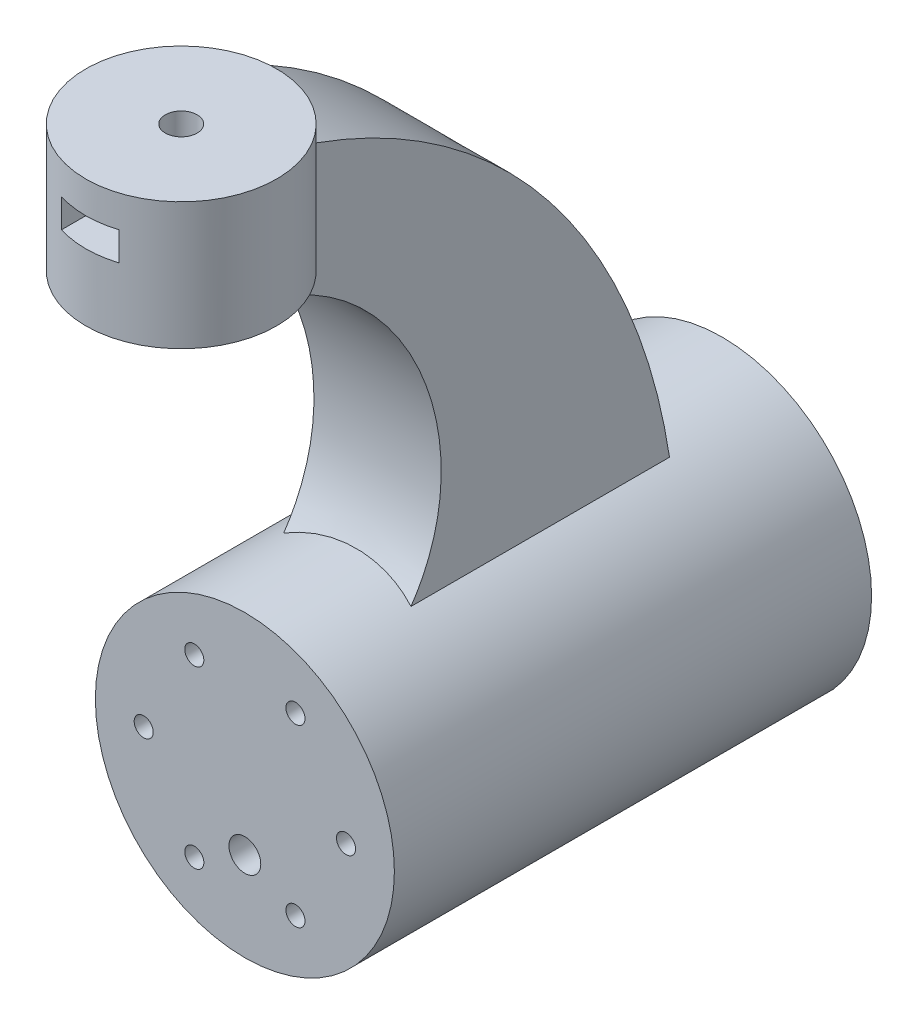
ISO-10303-21;
HEADER;
FILE_DESCRIPTION(('STEP AP214'),'2;1');
FILE_NAME('part.step','',(''),(''),'','','');
FILE_SCHEMA(('AUTOMOTIVE_DESIGN { 1 0 10303 214 1 1 1 1 }'));
ENDSEC;
DATA;
#1=APPLICATION_CONTEXT('core data for automotive mechanical design processes');
#2=APPLICATION_PROTOCOL_DEFINITION('international standard','automotive_design',2000,#1);
#3=PRODUCT_CONTEXT('',#1,'mechanical');
#4=PRODUCT('Part','Part','',(#3));
#5=PRODUCT_RELATED_PRODUCT_CATEGORY('part','',(#4));
#6=PRODUCT_DEFINITION_FORMATION('','',#4);
#7=PRODUCT_DEFINITION_CONTEXT('part definition',#1,'design');
#8=PRODUCT_DEFINITION('design','',#6,#7);
#9=PRODUCT_DEFINITION_SHAPE('','',#8);
#10=(LENGTH_UNIT() NAMED_UNIT(*) SI_UNIT(.MILLI.,.METRE.));
#11=(NAMED_UNIT(*) PLANE_ANGLE_UNIT() SI_UNIT($,.RADIAN.));
#12=(NAMED_UNIT(*) SI_UNIT($,.STERADIAN.) SOLID_ANGLE_UNIT());
#13=UNCERTAINTY_MEASURE_WITH_UNIT(LENGTH_MEASURE(1.E-05),#10,'distance_accuracy_value','');
#14=(GEOMETRIC_REPRESENTATION_CONTEXT(3) GLOBAL_UNCERTAINTY_ASSIGNED_CONTEXT((#13)) GLOBAL_UNIT_ASSIGNED_CONTEXT((#10,
#11,#12)) REPRESENTATION_CONTEXT('',''));
#15=CARTESIAN_POINT('',(0.,0.,0.));
#16=DIRECTION('',(0.,0.,1.));
#17=DIRECTION('',(1.,0.,0.));
#18=AXIS2_PLACEMENT_3D('',#15,#16,#17);
#19=CARTESIAN_POINT('',(0.,-95.,-85.));
#20=DIRECTION('',(0.,0.,1.));
#21=DIRECTION('',(1.,0.,0.));
#22=AXIS2_PLACEMENT_3D('',#19,#20,#21);
#23=CYLINDRICAL_SURFACE('',#22,19.);
#24=CARTESIAN_POINT('',(0.,-95.,-85.));
#25=DIRECTION('',(0.,0.,1.));
#26=DIRECTION('',(1.,0.,0.));
#27=AXIS2_PLACEMENT_3D('',#24,#25,#26);
#28=CIRCLE('',#27,19.);
#29=CARTESIAN_POINT('',(19.,-95.,-85.));
#30=VERTEX_POINT('',#29);
#31=EDGE_CURVE('E278',#30,#30,#28,.T.);
#32=ORIENTED_EDGE('',*,*,#31,.F.);
#33=EDGE_LOOP('',(#32));
#34=FACE_BOUND('',#33,.T.);
#35=CARTESIAN_POINT('',(0.,-95.,-15.));
#36=DIRECTION('',(0.,0.,1.));
#37=DIRECTION('',(1.,0.,0.));
#38=AXIS2_PLACEMENT_3D('',#35,#36,#37);
#39=CIRCLE('',#38,19.);
#40=CARTESIAN_POINT('',(19.,-95.,-15.));
#41=VERTEX_POINT('',#40);
#42=EDGE_CURVE('E11',#41,#41,#39,.F.);
#43=ORIENTED_EDGE('',*,*,#42,.F.);
#44=EDGE_LOOP('',(#43));
#45=FACE_BOUND('',#44,.T.);
#46=ADVANCED_FACE('F40',(#34,#45),#23,.F.);
#47=CARTESIAN_POINT('',(10.,0.,0.));
#48=DIRECTION('',(0.,0.,-1.));
#49=DIRECTION('',(0.,1.,0.));
#50=AXIS2_PLACEMENT_3D('',#47,#48,#49);
#51=PLANE('',#50);
#52=DIRECTION('',(-1.,0.,0.));
#53=VECTOR('',#52,1.);
#54=CARTESIAN_POINT('',(0.,-9.5,0.));
#55=LINE('',#54,#53);
#56=CARTESIAN_POINT('',(-2.5,-9.5,0.));
#57=VERTEX_POINT('',#56);
#58=CARTESIAN_POINT('',(-4.5,-9.5,0.));
#59=VERTEX_POINT('',#58);
#60=EDGE_CURVE('E186',#57,#59,#55,.T.);
#61=ORIENTED_EDGE('',*,*,#60,.F.);
#62=DIRECTION('',(0.,1.,0.));
#63=VECTOR('',#62,1.);
#64=CARTESIAN_POINT('',(-2.5,-30.,0.));
#65=LINE('',#64,#63);
#66=CARTESIAN_POINT('',(-2.5,-5.,0.));
#67=VERTEX_POINT('',#66);
#68=EDGE_CURVE('E152',#57,#67,#65,.T.);
#69=ORIENTED_EDGE('',*,*,#68,.T.);
#70=DIRECTION('',(-1.,0.,0.));
#71=VECTOR('',#70,1.);
#72=CARTESIAN_POINT('',(0.,-5.,0.));
#73=LINE('',#72,#71);
#74=CARTESIAN_POINT('',(-4.5,-5.,0.));
#75=VERTEX_POINT('',#74);
#76=EDGE_CURVE('E182',#67,#75,#73,.T.);
#77=ORIENTED_EDGE('',*,*,#76,.T.);
#78=DIRECTION('',(0.,-1.,0.));
#79=VECTOR('',#78,1.);
#80=CARTESIAN_POINT('',(-4.5,-9.5,0.));
#81=LINE('',#80,#79);
#82=EDGE_CURVE('E185',#75,#59,#81,.T.);
#83=ORIENTED_EDGE('',*,*,#82,.T.);
#84=EDGE_LOOP('',(#61,#69,#77,#83));
#85=FACE_BOUND('',#84,.T.);
#86=ADVANCED_FACE('F257',(#85),#51,.F.);
#87=CARTESIAN_POINT('',(0.,-20.,0.));
#88=DIRECTION('',(0.,1.,0.));
#89=DIRECTION('',(0.,0.,1.));
#90=AXIS2_PLACEMENT_3D('',#87,#88,#89);
#91=PLANE('',#90);
#92=DIRECTION('',(-1.,0.,0.));
#93=VECTOR('',#92,1.);
#94=CARTESIAN_POINT('',(10.,-20.,0.));
#95=LINE('',#94,#93);
#96=CARTESIAN_POINT('',(10.,-20.,0.));
#97=VERTEX_POINT('',#96);
#98=CARTESIAN_POINT('',(2.5,-20.,0.));
#99=VERTEX_POINT('',#98);
#100=EDGE_CURVE('E171',#97,#99,#95,.T.);
#101=ORIENTED_EDGE('',*,*,#100,.F.);
#102=DIRECTION('',(0.,0.,-1.));
#103=VECTOR('',#102,1.);
#104=CARTESIAN_POINT('',(10.,-20.,0.));
#105=LINE('',#104,#103);
#106=CARTESIAN_POINT('',(10.,-20.,-11.1803398874989));
#107=VERTEX_POINT('',#106);
#108=EDGE_CURVE('E630',#97,#107,#105,.T.);
#109=ORIENTED_EDGE('',*,*,#108,.T.);
#110=CARTESIAN_POINT('',(0.,-20.,0.));
#111=DIRECTION('',(0.,1.,0.));
#112=DIRECTION('',(0.,0.,1.));
#113=AXIS2_PLACEMENT_3D('',#110,#111,#112);
#114=CIRCLE('',#113,15.);
#115=CARTESIAN_POINT('',(-10.,-20.,-11.1803398874989));
#116=VERTEX_POINT('',#115);
#117=EDGE_CURVE('E614',#116,#107,#114,.T.);
#118=ORIENTED_EDGE('',*,*,#117,.F.);
#119=DIRECTION('',(0.,0.,-1.));
#120=VECTOR('',#119,1.);
#121=CARTESIAN_POINT('',(-10.,-20.,0.));
#122=LINE('',#121,#120);
#123=CARTESIAN_POINT('',(-10.,-20.,0.));
#124=VERTEX_POINT('',#123);
#125=EDGE_CURVE('E196',#124,#116,#122,.T.);
#126=ORIENTED_EDGE('',*,*,#125,.F.);
#127=CARTESIAN_POINT('',(-2.5,-20.,0.));
#128=VERTEX_POINT('',#127);
#129=EDGE_CURVE('E178',#128,#124,#95,.T.);
#130=ORIENTED_EDGE('',*,*,#129,.F.);
#131=CARTESIAN_POINT('',(0.,-20.,0.));
#132=DIRECTION('',(0.,1.,0.));
#133=DIRECTION('',(0.,0.,1.));
#134=AXIS2_PLACEMENT_3D('',#131,#132,#133);
#135=CIRCLE('',#134,2.5);
#136=EDGE_CURVE('E607',#128,#99,#135,.T.);
#137=ORIENTED_EDGE('',*,*,#136,.T.);
#138=EDGE_LOOP('',(#101,#109,#118,#126,#130,#137));
#139=FACE_BOUND('',#138,.T.);
#140=ADVANCED_FACE('F263',(#139),#91,.F.);
#141=CARTESIAN_POINT('',(0.,-9.5,0.));
#142=DIRECTION('',(0.,1.,0.));
#143=DIRECTION('',(0.,0.,1.));
#144=AXIS2_PLACEMENT_3D('',#141,#142,#143);
#145=PLANE('',#144);
#146=DIRECTION('',(0.,0.,-1.));
#147=VECTOR('',#146,1.);
#148=CARTESIAN_POINT('',(4.5,-9.5,2.59807621135332));
#149=LINE('',#148,#147);
#150=CARTESIAN_POINT('',(4.5,-9.5,14.3090880212542));
#151=VERTEX_POINT('',#150);
#152=CARTESIAN_POINT('',(4.5,-9.5,0.));
#153=VERTEX_POINT('',#152);
#154=EDGE_CURVE('E593',#151,#153,#149,.T.);
#155=ORIENTED_EDGE('',*,*,#154,.T.);
#156=CARTESIAN_POINT('',(2.5,-9.5,0.));
#157=VERTEX_POINT('',#156);
#158=EDGE_CURVE('E181',#153,#157,#55,.T.);
#159=ORIENTED_EDGE('',*,*,#158,.T.);
#160=CARTESIAN_POINT('',(0.,-9.5,0.));
#161=DIRECTION('',(0.,1.,0.));
#162=DIRECTION('',(0.,0.,1.));
#163=AXIS2_PLACEMENT_3D('',#160,#161,#162);
#164=CIRCLE('',#163,2.5);
#165=EDGE_CURVE('E601',#157,#57,#164,.F.);
#166=ORIENTED_EDGE('',*,*,#165,.T.);
#167=ORIENTED_EDGE('',*,*,#60,.T.);
#168=DIRECTION('',(0.,0.,1.));
#169=VECTOR('',#168,1.);
#170=CARTESIAN_POINT('',(-4.5,-9.5,-2.59807621135332));
#171=LINE('',#170,#169);
#172=CARTESIAN_POINT('',(-4.5,-9.5,14.3090880212542));
#173=VERTEX_POINT('',#172);
#174=EDGE_CURVE('E583',#59,#173,#171,.T.);
#175=ORIENTED_EDGE('',*,*,#174,.T.);
#176=CARTESIAN_POINT('',(0.,-9.5,0.));
#177=DIRECTION('',(0.,1.,0.));
#178=DIRECTION('',(0.,0.,1.));
#179=AXIS2_PLACEMENT_3D('',#176,#177,#178);
#180=CIRCLE('',#179,15.);
#181=EDGE_CURVE('E627',#151,#173,#180,.F.);
#182=ORIENTED_EDGE('',*,*,#181,.F.);
#183=EDGE_LOOP('',(#155,#159,#166,#167,#175,#182));
#184=FACE_BOUND('',#183,.T.);
#185=ADVANCED_FACE('F205',(#184),#145,.T.);
#186=CARTESIAN_POINT('',(0.,-5.,0.));
#187=DIRECTION('',(0.,1.,0.));
#188=DIRECTION('',(0.,0.,1.));
#189=AXIS2_PLACEMENT_3D('',#186,#187,#188);
#190=PLANE('',#189);
#191=CARTESIAN_POINT('',(4.5,-5.,0.));
#192=VERTEX_POINT('',#191);
#193=CARTESIAN_POINT('',(2.5,-5.,0.));
#194=VERTEX_POINT('',#193);
#195=EDGE_CURVE('E177',#192,#194,#73,.T.);
#196=ORIENTED_EDGE('',*,*,#195,.F.);
#197=DIRECTION('',(0.,0.,-1.));
#198=VECTOR('',#197,1.);
#199=CARTESIAN_POINT('',(4.5,-5.,2.59807621135332));
#200=LINE('',#199,#198);
#201=CARTESIAN_POINT('',(4.5,-5.,14.3090880212542));
#202=VERTEX_POINT('',#201);
#203=EDGE_CURVE('E594',#202,#192,#200,.T.);
#204=ORIENTED_EDGE('',*,*,#203,.F.);
#205=CARTESIAN_POINT('',(0.,-5.,0.));
#206=DIRECTION('',(0.,-1.,0.));
#207=DIRECTION('',(0.,0.,-1.));
#208=AXIS2_PLACEMENT_3D('',#205,#206,#207);
#209=CIRCLE('',#208,15.);
#210=CARTESIAN_POINT('',(-4.5,-5.,14.3090880212542));
#211=VERTEX_POINT('',#210);
#212=EDGE_CURVE('E591',#211,#202,#209,.F.);
#213=ORIENTED_EDGE('',*,*,#212,.F.);
#214=DIRECTION('',(0.,0.,1.));
#215=VECTOR('',#214,1.);
#216=CARTESIAN_POINT('',(-4.5,-5.,-2.59807621135332));
#217=LINE('',#216,#215);
#218=EDGE_CURVE('E581',#75,#211,#217,.T.);
#219=ORIENTED_EDGE('',*,*,#218,.F.);
#220=ORIENTED_EDGE('',*,*,#76,.F.);
#221=CARTESIAN_POINT('',(0.,-5.,0.));
#222=DIRECTION('',(0.,1.,0.));
#223=DIRECTION('',(0.,0.,1.));
#224=AXIS2_PLACEMENT_3D('',#221,#222,#223);
#225=CIRCLE('',#224,2.5);
#226=EDGE_CURVE('E605',#194,#67,#225,.F.);
#227=ORIENTED_EDGE('',*,*,#226,.F.);
#228=EDGE_LOOP('',(#196,#204,#213,#219,#220,#227));
#229=FACE_BOUND('',#228,.T.);
#230=ADVANCED_FACE('F515',(#229),#190,.F.);
#231=CARTESIAN_POINT('',(-4.5,-9.5,-2.59807621135332));
#232=DIRECTION('',(-1.,0.,0.));
#233=DIRECTION('',(0.,0.,1.));
#234=AXIS2_PLACEMENT_3D('',#231,#232,#233);
#235=PLANE('',#234);
#236=ORIENTED_EDGE('',*,*,#82,.F.);
#237=ORIENTED_EDGE('',*,*,#218,.T.);
#238=DIRECTION('',(0.,1.,0.));
#239=VECTOR('',#238,1.);
#240=CARTESIAN_POINT('',(-4.5,-20.,14.3090880212542));
#241=LINE('',#240,#239);
#242=EDGE_CURVE('E624',#173,#211,#241,.T.);
#243=ORIENTED_EDGE('',*,*,#242,.F.);
#244=ORIENTED_EDGE('',*,*,#174,.F.);
#245=EDGE_LOOP('',(#236,#237,#243,#244));
#246=FACE_BOUND('',#245,.T.);
#247=ADVANCED_FACE('F520',(#246),#235,.F.);
#248=CARTESIAN_POINT('',(4.5,-9.5,2.59807621135332));
#249=DIRECTION('',(1.,0.,0.));
#250=DIRECTION('',(0.,0.,-1.));
#251=AXIS2_PLACEMENT_3D('',#248,#249,#250);
#252=PLANE('',#251);
#253=DIRECTION('',(0.,1.,0.));
#254=VECTOR('',#253,1.);
#255=CARTESIAN_POINT('',(4.5,-9.5,0.));
#256=LINE('',#255,#254);
#257=EDGE_CURVE('E245',#153,#192,#256,.T.);
#258=ORIENTED_EDGE('',*,*,#257,.F.);
#259=ORIENTED_EDGE('',*,*,#154,.F.);
#260=DIRECTION('',(0.,1.,0.));
#261=VECTOR('',#260,1.);
#262=CARTESIAN_POINT('',(4.5,-20.,14.3090880212542));
#263=LINE('',#262,#261);
#264=EDGE_CURVE('E619',#202,#151,#263,.F.);
#265=ORIENTED_EDGE('',*,*,#264,.F.);
#266=ORIENTED_EDGE('',*,*,#203,.T.);
#267=EDGE_LOOP('',(#258,#259,#265,#266));
#268=FACE_BOUND('',#267,.T.);
#269=ADVANCED_FACE('F552',(#268),#252,.F.);
#270=CARTESIAN_POINT('',(0.,-20.,0.));
#271=DIRECTION('',(0.,1.,0.));
#272=DIRECTION('',(0.,0.,1.));
#273=AXIS2_PLACEMENT_3D('',#270,#271,#272);
#274=CYLINDRICAL_SURFACE('',#273,15.);
#275=DIRECTION('',(0.,1.,0.));
#276=VECTOR('',#275,1.);
#277=CARTESIAN_POINT('',(10.,-20.,-11.1803398874989));
#278=LINE('',#277,#276);
#279=CARTESIAN_POINT('',(10.,-3.17481404608277,-11.1803398874989));
#280=VERTEX_POINT('',#279);
#281=EDGE_CURVE('E64',#280,#107,#278,.F.);
#282=ORIENTED_EDGE('',*,*,#281,.F.);
#283=CARTESIAN_POINT('',(-10.,-3.17481404608277,-11.1803398874989));
#284=CARTESIAN_POINT('',(-9.79860012627537,-3.23924338649017,-11.3604844989368));
#285=CARTESIAN_POINT('',(-9.59210747727595,-3.3024801537701,-11.5353743147074));
#286=CARTESIAN_POINT('',(-9.16938355925211,-3.42616448989457,-11.8741633583894));
#287=CARTESIAN_POINT('',(-8.95314922130839,-3.48661116746445,-12.0380590817899));
#288=CARTESIAN_POINT('',(-8.5114969257201,-3.60427528012085,-12.3542785462998));
#289=CARTESIAN_POINT('',(-8.28607812252647,-3.66149241672435,-12.5066012182447));
#290=CARTESIAN_POINT('',(-7.82617948257629,-3.77238076993539,-12.7994287976597));
#291=CARTESIAN_POINT('',(-7.5916822645026,-3.82604459132219,-12.9399092150211));
#292=CARTESIAN_POINT('',(-7.1146878441912,-3.92927758745872,-13.2081820772462));
#293=CARTESIAN_POINT('',(-6.87219143302572,-3.97884716541586,-13.3359757717688));
#294=CARTESIAN_POINT('',(-6.37987047817691,-4.0734894696256,-13.5783857309811));
#295=CARTESIAN_POINT('',(-6.13004612174509,-4.11856231065433,-13.6930023320184));
#296=CARTESIAN_POINT('',(-5.49627479931357,-4.22529676905283,-13.9628792073201));
#297=CARTESIAN_POINT('',(-5.10810794246683,-4.28388988269717,-14.1095613069984));
#298=CARTESIAN_POINT('',(-4.3194601863778,-4.3888453943908,-14.3706240712393));
#299=CARTESIAN_POINT('',(-3.9189788592239,-4.4352073668866,-14.4850036119208));
#300=CARTESIAN_POINT('',(-3.10916489147425,-4.5146581316494,-14.6801330377635));
#301=CARTESIAN_POINT('',(-2.69984478551856,-4.54776456680161,-14.7609276294069));
#302=CARTESIAN_POINT('',(-1.87503495702732,-4.60004845746902,-14.8881950446769));
#303=CARTESIAN_POINT('',(-1.45954557447948,-4.61922667767969,-14.9346697525575));
#304=CARTESIAN_POINT('',(-0.644918594413032,-4.64266596531088,-14.99143254157));
#305=CARTESIAN_POINT('',(-0.245907927513343,-4.64757260287891,-15.0032867754213));
#306=CARTESIAN_POINT('',(0.551728219602001,-4.64421005433706,-14.9951544165716));
#307=CARTESIAN_POINT('',(0.950353708943395,-4.63594118844412,-14.9751685977101));
#308=CARTESIAN_POINT('',(1.74440504240981,-4.60639743172854,-14.9035575347411));
#309=CARTESIAN_POINT('',(2.13982967922674,-4.58511784573912,-14.8519208688043));
#310=CARTESIAN_POINT('',(2.92445412688925,-4.52999247203683,-14.7175402275892));
#311=CARTESIAN_POINT('',(3.31365404471253,-4.49614690052498,-14.6347967875108));
#312=CARTESIAN_POINT('',(4.07591215464092,-4.41731902105667,-14.4408694293758));
#313=CARTESIAN_POINT('',(4.44913608515175,-4.37255670759026,-14.3302460337876));
#314=CARTESIAN_POINT('',(5.18460796454807,-4.27242443844434,-14.0808605195664));
#315=CARTESIAN_POINT('',(5.54685532371088,-4.21705391399867,-13.9420968921532));
#316=CARTESIAN_POINT('',(6.2580678880408,-4.09670581999264,-13.6376744625656));
#317=CARTESIAN_POINT('',(6.60703707166086,-4.03173115701718,-13.4720237959698));
#318=CARTESIAN_POINT('',(7.2897587023197,-3.89326667679245,-13.1151736345221));
#319=CARTESIAN_POINT('',(7.62351487649744,-3.81977896100959,-12.9239804431223));
#320=CARTESIAN_POINT('',(8.3137484163763,-3.65602408844214,-12.4926636406594));
#321=CARTESIAN_POINT('',(8.6680506363551,-3.56480323722981,-12.2494170584638));
#322=CARTESIAN_POINT('',(9.35244134814911,-3.37496746574787,-11.7352002650151));
#323=CARTESIAN_POINT('',(9.68258560499282,-3.27637070986764,-11.4642975975488));
#324=CARTESIAN_POINT('',(10.,-3.17481404608277,-11.180339887499));
#325=B_SPLINE_CURVE_WITH_KNOTS('',3,(#283,#284,#285,#286,#287,#288,#289,#290,#291,#292,#293,
#294,#295,#296,#297,#298,#299,#300,#301,#302,#303,#304,#305,#306,#307,#308,#309,#310,#311,#312,
#313,#314,#315,#316,#317,#318,#319,#320,#321,#322,#323,#324),.UNSPECIFIED.,.F.,.F.,(4,2,2,2,2,2,
2,2,2,2,2,2,2,2,2,2,2,2,2,2,4),(0.,0.833271749180175,1.66680786467109,2.50042089212956,
3.33571759577708,4.17093193978983,5.00612496007209,6.26167623903293,7.51727119615828,
8.77118937856203,10.0250387123693,11.2212145771138,12.4173613704892,13.6139400712529,
14.8104981855274,15.9846901121363,17.1589450114393,18.332845260518,19.5064563446865,
20.82283749151,22.1360772786702),.UNSPECIFIED.);
#326=CARTESIAN_POINT('',(-10.,-3.1748140464768,-11.1803398874989));
#327=VERTEX_POINT('',#326);
#328=EDGE_CURVE('E189',#327,#280,#325,.T.);
#329=ORIENTED_EDGE('',*,*,#328,.F.);
#330=DIRECTION('',(0.,1.,0.));
#331=VECTOR('',#330,1.);
#332=CARTESIAN_POINT('',(-10.,-20.,-11.1803398874989));
#333=LINE('',#332,#331);
#334=EDGE_CURVE('E150',#327,#116,#333,.F.);
#335=ORIENTED_EDGE('',*,*,#334,.T.);
#336=ORIENTED_EDGE('',*,*,#117,.T.);
#337=EDGE_LOOP('',(#282,#329,#335,#336));
#338=FACE_BOUND('',#337,.T.);
#339=CARTESIAN_POINT('',(0.,0.,0.));
#340=DIRECTION('',(0.,1.,0.));
#341=DIRECTION('',(0.,0.,1.));
#342=AXIS2_PLACEMENT_3D('',#339,#340,#341);
#343=CIRCLE('',#342,15.);
#344=CARTESIAN_POINT('',(0.,0.,15.));
#345=VERTEX_POINT('',#344);
#346=EDGE_CURVE('E611',#345,#345,#343,.T.);
#347=ORIENTED_EDGE('',*,*,#346,.F.);
#348=EDGE_LOOP('',(#347));
#349=FACE_BOUND('',#348,.T.);
#350=ORIENTED_EDGE('',*,*,#242,.T.);
#351=ORIENTED_EDGE('',*,*,#212,.T.);
#352=ORIENTED_EDGE('',*,*,#264,.T.);
#353=ORIENTED_EDGE('',*,*,#181,.T.);
#354=EDGE_LOOP('',(#350,#351,#352,#353));
#355=FACE_BOUND('',#354,.T.);
#356=ADVANCED_FACE('F42',(#338,#349,#355),#274,.T.);
#357=CARTESIAN_POINT('',(0.,0.,0.));
#358=DIRECTION('',(0.,1.,0.));
#359=DIRECTION('',(0.,0.,1.));
#360=AXIS2_PLACEMENT_3D('',#357,#358,#359);
#361=PLANE('',#360);
#362=CARTESIAN_POINT('',(0.,0.,0.));
#363=DIRECTION('',(0.,1.,0.));
#364=DIRECTION('',(0.,0.,1.));
#365=AXIS2_PLACEMENT_3D('',#362,#363,#364);
#366=CIRCLE('',#365,2.5);
#367=CARTESIAN_POINT('',(0.,0.,2.5));
#368=VERTEX_POINT('',#367);
#369=EDGE_CURVE('E604',#368,#368,#366,.T.);
#370=ORIENTED_EDGE('',*,*,#369,.F.);
#371=EDGE_LOOP('',(#370));
#372=FACE_BOUND('',#371,.T.);
#373=ORIENTED_EDGE('',*,*,#346,.T.);
#374=EDGE_LOOP('',(#373));
#375=FACE_BOUND('',#374,.T.);
#376=ADVANCED_FACE('F499',(#372,#375),#361,.T.);
#377=CARTESIAN_POINT('',(0.,-20.,0.));
#378=DIRECTION('',(0.,1.,0.));
#379=DIRECTION('',(0.,0.,1.));
#380=AXIS2_PLACEMENT_3D('',#377,#378,#379);
#381=CYLINDRICAL_SURFACE('',#380,2.5);
#382=ORIENTED_EDGE('',*,*,#369,.T.);
#383=EDGE_LOOP('',(#382));
#384=FACE_BOUND('',#383,.T.);
#385=ORIENTED_EDGE('',*,*,#136,.F.);
#386=CARTESIAN_POINT('',(2.5,-20.,0.));
#387=CARTESIAN_POINT('',(2.49999924223519,-20.010640029569,-0.0713318224568461));
#388=CARTESIAN_POINT('',(2.49694530400625,-20.0215256960482,-0.142590655928667));
#389=CARTESIAN_POINT('',(2.48477906664822,-20.0437069580382,-0.284518573582058));
#390=CARTESIAN_POINT('',(2.47566730574732,-20.0550025170463,-0.355187709592569));
#391=CARTESIAN_POINT('',(2.43935482856817,-20.0893486544265,-0.565441899064675));
#392=CARTESIAN_POINT('',(2.40317658304411,-20.112892896027,-0.703502375000567));
#393=CARTESIAN_POINT('',(2.30795257821508,-20.1603490705761,-0.971389276121613));
#394=CARTESIAN_POINT('',(2.24890067692636,-20.1842611006249,-1.10121347881491));
#395=CARTESIAN_POINT('',(2.10955933659905,-20.2314092854754,-1.34905718257327));
#396=CARTESIAN_POINT('',(2.02927237882344,-20.2546455188903,-1.46707806060815));
#397=CARTESIAN_POINT('',(1.84946296507005,-20.2993420429519,-1.68814177236846));
#398=CARTESIAN_POINT('',(1.74990997458561,-20.3207994361886,-1.79116036882827));
#399=CARTESIAN_POINT('',(1.53432689122771,-20.360740910869,-1.978957428896));
#400=CARTESIAN_POINT('',(1.41829589577195,-20.3792248293223,-2.06373489270613));
#401=CARTESIAN_POINT('',(1.1747098733048,-20.4119003469212,-2.21134698174232));
#402=CARTESIAN_POINT('',(1.04733727456583,-20.4261479934171,-2.27447000133163));
#403=CARTESIAN_POINT('',(0.783359086326104,-20.4498120464848,-2.37833032085156));
#404=CARTESIAN_POINT('',(0.646755441526156,-20.4592294670695,-2.41907231937428));
#405=CARTESIAN_POINT('',(0.371639634659488,-20.4724664837814,-2.47611740375701));
#406=CARTESIAN_POINT('',(0.23324790671969,-20.4764125174906,-2.4929726952405));
#407=CARTESIAN_POINT('',(-0.04446154843755,-20.4788646584516,-2.50346200485308));
#408=CARTESIAN_POINT('',(-0.183779200267726,-20.477371203291,-2.49709789090025));
#409=CARTESIAN_POINT('',(-0.457313736670765,-20.4691033538324,-2.4616321052593));
#410=CARTESIAN_POINT('',(-0.591574698886168,-20.4624030666462,-2.43284949548345));
#411=CARTESIAN_POINT('',(-0.853349205827652,-20.4442136753847,-2.35381896058335));
#412=CARTESIAN_POINT('',(-0.980862571731216,-20.432724444466,-2.30357046689737));
#413=CARTESIAN_POINT('',(-1.16481667900987,-20.4123767862456,-2.2131300375497));
#414=CARTESIAN_POINT('',(-1.22516013828832,-20.4050366880689,-2.18029688186792));
#415=CARTESIAN_POINT('',(-1.34285801363391,-20.3894230540195,-2.10984096841924));
#416=CARTESIAN_POINT('',(-1.40021306857383,-20.3811497188648,-2.07221924034229));
#417=CARTESIAN_POINT('',(-1.51153965240599,-20.3637855298279,-1.99246968895401));
#418=CARTESIAN_POINT('',(-1.56551221060302,-20.3546949267132,-1.95034324710582));
#419=CARTESIAN_POINT('',(-1.66979218844273,-20.3358091990963,-1.86184843988003));
#420=CARTESIAN_POINT('',(-1.72009621674519,-20.3260134389293,-1.81547623665427));
#421=CARTESIAN_POINT('',(-1.8670618051104,-20.2953240069953,-1.66839267797891));
#422=CARTESIAN_POINT('',(-1.95739915462669,-20.2735038609432,-1.56141675852471));
#423=CARTESIAN_POINT('',(-2.11887818381152,-20.2285445566643,-1.3340906341034));
#424=CARTESIAN_POINT('',(-2.19001816710842,-20.2054052820916,-1.21373924854153));
#425=CARTESIAN_POINT('',(-2.28155192362457,-20.1702767245093,-1.02449125608952));
#426=CARTESIAN_POINT('',(-2.3097400525562,-20.158373955346,-0.959245118426306));
#427=CARTESIAN_POINT('',(-2.36045118302564,-20.134631324296,-0.826619892172223));
#428=CARTESIAN_POINT('',(-2.38297876826948,-20.1227914191594,-0.759242579437001));
#429=CARTESIAN_POINT('',(-2.42220527188703,-20.0993007159695,-0.622859565934707));
#430=CARTESIAN_POINT('',(-2.43890987198716,-20.0876497442127,-0.55385552303988));
#431=CARTESIAN_POINT('',(-2.46639444848519,-20.0646359713174,-0.414643070202456));
#432=CARTESIAN_POINT('',(-2.47717612949173,-20.0532730881663,-0.344435012778478));
#433=CARTESIAN_POINT('',(-2.4899652966079,-20.0349057955147,-0.228401351118591));
#434=CARTESIAN_POINT('',(-2.49372938618993,-20.0277878877131,-0.18277997643114));
#435=CARTESIAN_POINT('',(-2.4987449738133,-20.0137462649935,-0.0914457863172876));
#436=CARTESIAN_POINT('',(-2.50000054925778,-20.0068222530081,-0.0457332403712202));
#437=CARTESIAN_POINT('',(-2.5,-20.,0.));
#438=B_SPLINE_CURVE_WITH_KNOTS('',3,(#386,#387,#388,#389,#390,#391,#392,#393,#394,#395,#396,
#397,#398,#399,#400,#401,#402,#403,#404,#405,#406,#407,#408,#409,#410,#411,#412,#413,#414,#415,
#416,#417,#418,#419,#420,#421,#422,#423,#424,#425,#426,#427,#428,#429,#430,#431,#432,#433,#434,
#435,#436,#437),.UNSPECIFIED.,.F.,.F.,(4,2,2,2,2,2,2,2,2,2,2,2,2,2,2,2,2,2,2,2,2,2,2,2,2,4),(0.,
0.216227383477077,0.432435558052047,0.864167211238322,1.29601487251225,1.72781209574803,
2.1602993582856,2.59281031944572,3.0193144843565,3.44572907624546,3.86211552381195,
4.2784684753174,4.68900177460998,5.09954594827406,5.30661609195308,5.51364178418551,
5.72060416882653,5.92775551446169,6.35079559569132,6.77387304654616,6.98985307927146,
7.20565765133542,7.42125106067032,7.63678238994489,7.77569841089403,7.91438844988279),.UNSPECIFIED.);
#439=EDGE_CURVE('E137',#99,#128,#438,.T.);
#440=ORIENTED_EDGE('',*,*,#439,.F.);
#441=EDGE_LOOP('',(#385,#440));
#442=FACE_BOUND('',#441,.T.);
#443=ORIENTED_EDGE('',*,*,#226,.T.);
#444=ORIENTED_EDGE('',*,*,#68,.F.);
#445=ORIENTED_EDGE('',*,*,#165,.F.);
#446=DIRECTION('',(0.,1.,0.));
#447=VECTOR('',#446,1.);
#448=CARTESIAN_POINT('',(2.5,-30.,0.));
#449=LINE('',#448,#447);
#450=EDGE_CURVE('E155',#194,#157,#449,.F.);
#451=ORIENTED_EDGE('',*,*,#450,.F.);
#452=EDGE_LOOP('',(#443,#444,#445,#451));
#453=FACE_BOUND('',#452,.T.);
#454=ADVANCED_FACE('F490',(#384,#442,#453),#381,.F.);
#455=ORIENTED_EDGE('',*,*,#195,.T.);
#456=ORIENTED_EDGE('',*,*,#450,.T.);
#457=ORIENTED_EDGE('',*,*,#158,.F.);
#458=ORIENTED_EDGE('',*,*,#257,.T.);
#459=EDGE_LOOP('',(#455,#456,#457,#458));
#460=FACE_BOUND('',#459,.T.);
#461=ADVANCED_FACE('F203',(#460),#51,.F.);
#462=CARTESIAN_POINT('',(10.,0.,0.));
#463=CARTESIAN_POINT('',(10.,-8.89477506259285,-41.4152513778114));
#464=CARTESIAN_POINT('',(10.,-43.7741700893635,-64.2405724174806));
#465=CARTESIAN_POINT('',(10.,-80.,-67.5));
#466=B_SPLINE_CURVE_WITH_KNOTS('',3,(#462,#463,#464,#465),.UNSPECIFIED.,.F.,.F.,(4,4),(0.,1.),.UNSPECIFIED.);
#467=DIRECTION('',(-1.,0.,0.));
#468=VECTOR('',#467,1.);
#469=SURFACE_OF_LINEAR_EXTRUSION('',#466,#468);
#470=CARTESIAN_POINT('',(-10.,-73.7338296818633,-66.7384650228675));
#471=CARTESIAN_POINT('',(-9.60623646792274,-73.5486555783584,-66.7100609071896));
#472=CARTESIAN_POINT('',(-9.20724852389673,-73.3744082893317,-66.6828166217311));
#473=CARTESIAN_POINT('',(-8.40004612253742,-73.0482676163671,-66.6310523642006));
#474=CARTESIAN_POINT('',(-7.99183126651712,-72.8963752005024,-66.6065325101208));
#475=CARTESIAN_POINT('',(-7.1674268382722,-72.6154590279875,-66.5606240294023));
#476=CARTESIAN_POINT('',(-6.75123717281667,-72.4864355388715,-66.5392354393956));
#477=CARTESIAN_POINT('',(-5.9124140791518,-72.2517490199073,-66.4999448556267));
#478=CARTESIAN_POINT('',(-5.48978439910629,-72.146072917959,-66.4820409114985));
#479=CARTESIAN_POINT('',(-4.63917855689283,-71.9583487608396,-66.4499966516537));
#480=CARTESIAN_POINT('',(-4.21120260790543,-71.876299766664,-66.4358561863681));
#481=CARTESIAN_POINT('',(-3.35127865087405,-71.7361062322683,-66.4115670454019));
#482=CARTESIAN_POINT('',(-2.91933076602867,-71.67796095316,-66.4014182463353));
#483=CARTESIAN_POINT('',(-1.83541029059378,-71.5626541501917,-66.3812347280746));
#484=CARTESIAN_POINT('',(-1.18172245680363,-71.5206072231819,-66.3738092448411));
#485=CARTESIAN_POINT('',(0.126917903779924,-71.4912305723337,-66.3686281087343));
#486=CARTESIAN_POINT('',(0.781870425657821,-71.5039006362508,-66.3708724183525));
#487=CARTESIAN_POINT('',(1.87013901892314,-71.5704727662827,-66.382585214599));
#488=CARTESIAN_POINT('',(2.30447006969889,-71.6092019673924,-66.3893925743008));
#489=CARTESIAN_POINT('',(3.17021397403145,-71.710739821107,-66.4071388199576));
#490=CARTESIAN_POINT('',(3.60162704191006,-71.77354668526,-66.4180773990512));
#491=CARTESIAN_POINT('',(4.46005778978027,-71.9230059519085,-66.4439059609147));
#492=CARTESIAN_POINT('',(4.88707663811066,-72.0096518367298,-66.4587948636123));
#493=CARTESIAN_POINT('',(5.71537156632137,-72.2018286685446,-66.4914879221211));
#494=CARTESIAN_POINT('',(6.11690806107251,-72.3062690864603,-66.5091203306408));
#495=CARTESIAN_POINT('',(6.91374923081616,-72.536206949708,-66.5474921101768));
#496=CARTESIAN_POINT('',(7.30905422942776,-72.6617032975789,-66.5682313192569));
#497=CARTESIAN_POINT('',(7.96147738633581,-72.8879872809577,-66.6051134349117));
#498=CARTESIAN_POINT('',(8.22065013839109,-72.9830272079348,-66.6204778375281));
#499=CARTESIAN_POINT('',(8.73545510906207,-73.1821636236099,-66.6523504801903));
#500=CARTESIAN_POINT('',(8.99108700341441,-73.2862609354881,-66.6688588241754));
#501=CARTESIAN_POINT('',(9.49851322811932,-73.5033851745932,-66.7029121600086));
#502=CARTESIAN_POINT('',(9.75030687748841,-73.6164136648952,-66.7204573331795));
#503=CARTESIAN_POINT('',(10.,-73.7338296818633,-66.7384650228675));
#504=B_SPLINE_CURVE_WITH_KNOTS('',3,(#470,#471,#472,#473,#474,#475,#476,#477,#478,#479,#480,
#481,#482,#483,#484,#485,#486,#487,#488,#489,#490,#491,#492,#493,#494,#495,#496,#497,#498,#499,
#500,#501,#502,#503),.UNSPECIFIED.,.F.,.F.,(4,2,2,2,2,2,2,2,2,2,2,2,2,2,2,2,4),(0.,
1.30800606976993,2.61606876581814,3.92414676334327,5.23149050715352,6.53878228645303,
7.84603365299494,9.80881812397192,11.7715949814113,13.0792801419892,14.3868681885427,
15.6940990904593,16.9393332602156,18.1845025469888,19.0137737535288,19.8431204072451,
20.6726125305183),.UNSPECIFIED.);
#505=CARTESIAN_POINT('',(-10.,-73.7338296818633,-66.7384650228674));
#506=VERTEX_POINT('',#505);
#507=CARTESIAN_POINT('',(10.,-73.7338296818633,-66.7384650228675));
#508=VERTEX_POINT('',#507);
#509=EDGE_CURVE('E131',#506,#508,#504,.T.);
#510=ORIENTED_EDGE('',*,*,#509,.F.);
#511=CARTESIAN_POINT('',(-10.,0.,0.));
#512=CARTESIAN_POINT('',(-10.,-8.89477506259285,-41.4152513778114));
#513=CARTESIAN_POINT('',(-10.,-43.7741700893635,-64.2405724174806));
#514=CARTESIAN_POINT('',(-10.,-80.,-67.5));
#515=B_SPLINE_CURVE_WITH_KNOTS('',3,(#511,#512,#513,#514),.UNSPECIFIED.,.F.,.F.,(4,4),(0.,1.),.UNSPECIFIED.);
#516=EDGE_CURVE('E142',#327,#506,#515,.T.);
#517=ORIENTED_EDGE('',*,*,#516,.F.);
#518=ORIENTED_EDGE('',*,*,#328,.T.);
#519=EDGE_CURVE('E144',#280,#508,#466,.T.);
#520=ORIENTED_EDGE('',*,*,#519,.T.);
#521=EDGE_LOOP('',(#510,#517,#518,#520));
#522=FACE_BOUND('',#521,.T.);
#523=ADVANCED_FACE('F141',(#522),#469,.T.);
#524=CARTESIAN_POINT('',(10.,-20.,0.));
#525=CARTESIAN_POINT('',(10.,-24.0703342402127,-27.2842631028096));
#526=CARTESIAN_POINT('',(10.,-63.4000097751706,-42.4562000248171));
#527=CARTESIAN_POINT('',(10.,-80.,-20.));
#528=B_SPLINE_CURVE_WITH_KNOTS('',3,(#524,#525,#526,#527),.UNSPECIFIED.,.F.,.F.,(4,4),(0.,1.),.UNSPECIFIED.);
#529=DIRECTION('',(-1.,0.,0.));
#530=VECTOR('',#529,1.);
#531=SURFACE_OF_LINEAR_EXTRUSION('',#528,#530);
#532=CARTESIAN_POINT('',(-10.,-20.,0.));
#533=CARTESIAN_POINT('',(-10.,-24.0703342402127,-27.2842631028096));
#534=CARTESIAN_POINT('',(-10.,-63.4000097751706,-42.4562000248171));
#535=CARTESIAN_POINT('',(-10.,-80.,-20.));
#536=B_SPLINE_CURVE_WITH_KNOTS('',3,(#532,#533,#534,#535),.UNSPECIFIED.,.F.,.F.,(4,4),(0.,1.),.UNSPECIFIED.);
#537=CARTESIAN_POINT('',(-10.,-73.733829681865,-26.1064632107406));
#538=VERTEX_POINT('',#537);
#539=EDGE_CURVE('E151',#124,#538,#536,.T.);
#540=ORIENTED_EDGE('',*,*,#539,.T.);
#541=CARTESIAN_POINT('',(-10.,-73.7338296818633,-26.1064632107418));
#542=CARTESIAN_POINT('',(-9.67083521077281,-73.5790134081496,-26.2133183106855));
#543=CARTESIAN_POINT('',(-9.33616381199183,-73.4310055041875,-26.3129950045543));
#544=CARTESIAN_POINT('',(-8.65717950850527,-73.1496486176265,-26.4986689845208));
#545=CARTESIAN_POINT('',(-8.31287069884833,-73.0162935240479,-26.5846719799984));
#546=CARTESIAN_POINT('',(-7.61574530323099,-72.765167465312,-26.7437551793489));
#547=CARTESIAN_POINT('',(-7.26292969030461,-72.6473947277013,-26.816836853308));
#548=CARTESIAN_POINT('',(-6.55058712157579,-72.4283717922702,-26.9506520869791));
#549=CARTESIAN_POINT('',(-6.19107257361212,-72.3270938894641,-27.0114063950313));
#550=CARTESIAN_POINT('',(-5.46593486064983,-72.1414425091973,-27.1213367241121));
#551=CARTESIAN_POINT('',(-5.10031123956904,-72.0570703000212,-27.1705118765074));
#552=CARTESIAN_POINT('',(-4.36416777390653,-71.9057312947367,-27.2578068530595));
#553=CARTESIAN_POINT('',(-3.99364780137329,-71.8387649544275,-27.2959263877109));
#554=CARTESIAN_POINT('',(-3.24922377440934,-71.7226647463256,-27.3615099115713));
#555=CARTESIAN_POINT('',(-2.87532293282601,-71.6735154666538,-27.3889831113589));
#556=CARTESIAN_POINT('',(-2.12499190675553,-71.5932324369525,-27.4336410038789));
#557=CARTESIAN_POINT('',(-1.74856178267776,-71.5620982581867,-27.4508259414592));
#558=CARTESIAN_POINT('',(-0.994320385795488,-71.5180062026088,-27.4751136293877));
#559=CARTESIAN_POINT('',(-0.616509131332639,-71.5050480852883,-27.4822165131431));
#560=CARTESIAN_POINT('',(0.139418015598388,-71.4973734231477,-27.4864268494797));
#561=CARTESIAN_POINT('',(0.517533948466142,-71.5026599313557,-27.4835326291605));
#562=CARTESIAN_POINT('',(1.2728646344805,-71.5314538009037,-27.467709946412));
#563=CARTESIAN_POINT('',(1.65007937460602,-71.5549614239371,-27.4547813398679));
#564=CARTESIAN_POINT('',(2.40249155641747,-71.6200808201011,-27.4187322385157));
#565=CARTESIAN_POINT('',(2.77768884971984,-71.6616939069403,-27.3956110041424));
#566=CARTESIAN_POINT('',(3.45116004609638,-71.7528259653312,-27.344497149278));
#567=CARTESIAN_POINT('',(3.75001080389695,-71.7991670286365,-27.3183646603974));
#568=CARTESIAN_POINT('',(4.34505735156792,-71.903210229395,-27.2591586491765));
#569=CARTESIAN_POINT('',(4.64125301003048,-71.9609129259546,-27.2260847852455));
#570=CARTESIAN_POINT('',(5.23035009619196,-72.0874662961753,-27.1527614885542));
#571=CARTESIAN_POINT('',(5.52325158813107,-72.156316752037,-27.1125121959822));
#572=CARTESIAN_POINT('',(6.1051359509975,-72.3049019375218,-27.0245631639765));
#573=CARTESIAN_POINT('',(6.39411901004634,-72.3846361425743,-26.9768637836032));
#574=CARTESIAN_POINT('',(6.96816484108992,-72.5548559745143,-26.8735929959312));
#575=CARTESIAN_POINT('',(7.25321798942103,-72.645364064082,-26.8180050936754));
#576=CARTESIAN_POINT('',(7.81815172962849,-72.8366191922167,-26.6986910318238));
#577=CARTESIAN_POINT('',(8.09803215474761,-72.9373665601975,-26.6349646103821));
#578=CARTESIAN_POINT('',(8.65202558551272,-73.1486770513799,-26.4990012364919));
#579=CARTESIAN_POINT('',(8.92613751591163,-73.2592419848755,-26.4267627136619));
#580=CARTESIAN_POINT('',(9.46801719534331,-73.4896878248628,-26.2733816246536));
#581=CARTESIAN_POINT('',(9.7357823086342,-73.6095725162349,-26.1922354353801));
#582=CARTESIAN_POINT('',(10.,-73.7338296818632,-26.1064632107419));
#583=B_SPLINE_CURVE_WITH_KNOTS('',3,(#541,#542,#543,#544,#545,#546,#547,#548,#549,#550,#551,
#552,#553,#554,#555,#556,#557,#558,#559,#560,#561,#562,#563,#564,#565,#566,#567,#568,#569,#570,
#571,#572,#573,#574,#575,#576,#577,#578,#579,#580,#581,#582),.UNSPECIFIED.,.F.,.F.,(4,2,2,2,2,2,
2,2,2,2,2,2,2,2,2,2,2,2,2,2,4),(0.,1.13717386564243,2.27387165630406,3.41044003910825,
4.54507928478253,5.67980362055811,6.81455766783431,7.94832778962371,9.08207092802959,
10.2157990644336,11.3497169263949,12.4836510741028,13.617667512303,14.5280267779146,
15.4384308535475,16.3488171443155,17.2591595721379,18.1714343757749,19.0837385380292,
19.9962112738555,20.9090565328081),.UNSPECIFIED.);
#584=CARTESIAN_POINT('',(10.,-73.7338296818633,-26.1064632107418));
#585=VERTEX_POINT('',#584);
#586=EDGE_CURVE('E56',#538,#585,#583,.T.);
#587=ORIENTED_EDGE('',*,*,#586,.T.);
#588=EDGE_CURVE('E160',#97,#585,#528,.T.);
#589=ORIENTED_EDGE('',*,*,#588,.F.);
#590=ORIENTED_EDGE('',*,*,#100,.T.);
#591=ORIENTED_EDGE('',*,*,#439,.T.);
#592=ORIENTED_EDGE('',*,*,#129,.T.);
#593=EDGE_LOOP('',(#540,#587,#589,#590,#591,#592));
#594=FACE_BOUND('',#593,.T.);
#595=ADVANCED_FACE('F202',(#594),#531,.F.);
#596=CARTESIAN_POINT('',(10.,0.,0.));
#597=DIRECTION('',(1.,0.,0.));
#598=DIRECTION('',(0.,0.,-1.));
#599=AXIS2_PLACEMENT_3D('',#596,#597,#598);
#600=PLANE('',#599);
#601=DIRECTION('',(0.,0.,1.));
#602=VECTOR('',#601,1.);
#603=CARTESIAN_POINT('',(10.,-73.7338296818633,-85.));
#604=LINE('',#603,#602);
#605=EDGE_CURVE('E145',#508,#585,#604,.T.);
#606=ORIENTED_EDGE('',*,*,#605,.F.);
#607=ORIENTED_EDGE('',*,*,#519,.F.);
#608=ORIENTED_EDGE('',*,*,#281,.T.);
#609=ORIENTED_EDGE('',*,*,#108,.F.);
#610=ORIENTED_EDGE('',*,*,#588,.T.);
#611=EDGE_LOOP('',(#606,#607,#608,#609,#610));
#612=FACE_BOUND('',#611,.T.);
#613=ADVANCED_FACE('F237',(#612),#600,.T.);
#614=CARTESIAN_POINT('',(-10.,0.,0.));
#615=DIRECTION('',(1.,0.,0.));
#616=DIRECTION('',(0.,0.,-1.));
#617=AXIS2_PLACEMENT_3D('',#614,#615,#616);
#618=PLANE('',#617);
#619=ORIENTED_EDGE('',*,*,#516,.T.);
#620=DIRECTION('',(0.,0.,1.));
#621=VECTOR('',#620,1.);
#622=CARTESIAN_POINT('',(-10.,-73.7338296818633,-85.));
#623=LINE('',#622,#621);
#624=EDGE_CURVE('E49',#506,#538,#623,.T.);
#625=ORIENTED_EDGE('',*,*,#624,.T.);
#626=ORIENTED_EDGE('',*,*,#539,.F.);
#627=ORIENTED_EDGE('',*,*,#125,.T.);
#628=ORIENTED_EDGE('',*,*,#334,.F.);
#629=EDGE_LOOP('',(#619,#625,#626,#627,#628));
#630=FACE_BOUND('',#629,.T.);
#631=ADVANCED_FACE('F148',(#630),#618,.F.);
#632=CARTESIAN_POINT('',(0.,-95.,-85.));
#633=DIRECTION('',(0.,0.,1.));
#634=DIRECTION('',(1.,0.,0.));
#635=AXIS2_PLACEMENT_3D('',#632,#633,#634);
#636=CYLINDRICAL_SURFACE('',#635,23.5);
#637=ORIENTED_EDGE('',*,*,#509,.T.);
#638=ORIENTED_EDGE('',*,*,#605,.T.);
#639=ORIENTED_EDGE('',*,*,#586,.F.);
#640=ORIENTED_EDGE('',*,*,#624,.F.);
#641=EDGE_LOOP('',(#637,#638,#639,#640));
#642=FACE_BOUND('',#641,.T.);
#643=CARTESIAN_POINT('',(0.,-95.,-85.));
#644=DIRECTION('',(0.,0.,1.));
#645=DIRECTION('',(1.,0.,0.));
#646=AXIS2_PLACEMENT_3D('',#643,#644,#645);
#647=CIRCLE('',#646,23.5);
#648=CARTESIAN_POINT('',(23.5,-95.,-85.));
#649=VERTEX_POINT('',#648);
#650=EDGE_CURVE('E281',#649,#649,#647,.T.);
#651=ORIENTED_EDGE('',*,*,#650,.T.);
#652=EDGE_LOOP('',(#651));
#653=FACE_BOUND('',#652,.T.);
#654=CARTESIAN_POINT('',(0.,-95.,-10.));
#655=DIRECTION('',(0.,0.,1.));
#656=DIRECTION('',(1.,0.,0.));
#657=AXIS2_PLACEMENT_3D('',#654,#655,#656);
#658=CIRCLE('',#657,23.5);
#659=CARTESIAN_POINT('',(23.5,-95.,-10.));
#660=VERTEX_POINT('',#659);
#661=EDGE_CURVE('E282',#660,#660,#658,.T.);
#662=ORIENTED_EDGE('',*,*,#661,.F.);
#663=EDGE_LOOP('',(#662));
#664=FACE_BOUND('',#663,.T.);
#665=ADVANCED_FACE('F129',(#642,#653,#664),#636,.T.);
#666=CARTESIAN_POINT('',(0.,-95.,-85.));
#667=DIRECTION('',(0.,0.,1.));
#668=DIRECTION('',(1.,0.,0.));
#669=AXIS2_PLACEMENT_3D('',#666,#667,#668);
#670=PLANE('',#669);
#671=ORIENTED_EDGE('',*,*,#31,.T.);
#672=EDGE_LOOP('',(#671));
#673=FACE_BOUND('',#672,.T.);
#674=ORIENTED_EDGE('',*,*,#650,.F.);
#675=EDGE_LOOP('',(#674));
#676=FACE_BOUND('',#675,.T.);
#677=ADVANCED_FACE('F231',(#673,#676),#670,.F.);
#678=CARTESIAN_POINT('',(0.,-95.,-10.));
#679=DIRECTION('',(0.,0.,1.));
#680=DIRECTION('',(1.,0.,0.));
#681=AXIS2_PLACEMENT_3D('',#678,#679,#680);
#682=PLANE('',#681);
#683=CARTESIAN_POINT('',(15.9,-95.,-10.));
#684=DIRECTION('',(0.,0.,1.));
#685=DIRECTION('',(1.,0.,0.));
#686=AXIS2_PLACEMENT_3D('',#683,#684,#685);
#687=CIRCLE('',#686,1.5);
#688=CARTESIAN_POINT('',(17.4,-95.,-10.));
#689=VERTEX_POINT('',#688);
#690=EDGE_CURVE('E324',#689,#689,#687,.T.);
#691=ORIENTED_EDGE('',*,*,#690,.F.);
#692=EDGE_LOOP('',(#691));
#693=FACE_BOUND('',#692,.T.);
#694=CARTESIAN_POINT('',(0.,-104.5,-10.));
#695=DIRECTION('',(0.,0.,1.));
#696=DIRECTION('',(1.,0.,0.));
#697=AXIS2_PLACEMENT_3D('',#694,#695,#696);
#698=CIRCLE('',#697,2.5);
#699=CARTESIAN_POINT('',(2.5,-104.5,-10.));
#700=VERTEX_POINT('',#699);
#701=EDGE_CURVE('E318',#700,#700,#698,.T.);
#702=ORIENTED_EDGE('',*,*,#701,.F.);
#703=EDGE_LOOP('',(#702));
#704=FACE_BOUND('',#703,.T.);
#705=CARTESIAN_POINT('',(7.94999999999999,-108.769803920173,-10.));
#706=DIRECTION('',(0.,0.,1.));
#707=DIRECTION('',(1.,0.,0.));
#708=AXIS2_PLACEMENT_3D('',#705,#706,#707);
#709=CIRCLE('',#708,1.5);
#710=CARTESIAN_POINT('',(9.44999999999998,-108.769803920173,-10.));
#711=VERTEX_POINT('',#710);
#712=EDGE_CURVE('E312',#711,#711,#709,.T.);
#713=ORIENTED_EDGE('',*,*,#712,.F.);
#714=EDGE_LOOP('',(#713));
#715=FACE_BOUND('',#714,.T.);
#716=CARTESIAN_POINT('',(-7.9500000000001,-108.769803920173,-10.));
#717=DIRECTION('',(0.,0.,1.));
#718=DIRECTION('',(1.,0.,0.));
#719=AXIS2_PLACEMENT_3D('',#716,#717,#718);
#720=CIRCLE('',#719,1.5);
#721=CARTESIAN_POINT('',(-6.4500000000001,-108.769803920173,-10.));
#722=VERTEX_POINT('',#721);
#723=EDGE_CURVE('E306',#722,#722,#720,.T.);
#724=ORIENTED_EDGE('',*,*,#723,.F.);
#725=EDGE_LOOP('',(#724));
#726=FACE_BOUND('',#725,.T.);
#727=CARTESIAN_POINT('',(-15.9,-94.9999999999999,-10.));
#728=DIRECTION('',(0.,0.,1.));
#729=DIRECTION('',(1.,0.,0.));
#730=AXIS2_PLACEMENT_3D('',#727,#728,#729);
#731=CIRCLE('',#730,1.5);
#732=CARTESIAN_POINT('',(-14.4,-94.9999999999999,-10.));
#733=VERTEX_POINT('',#732);
#734=EDGE_CURVE('E300',#733,#733,#731,.T.);
#735=ORIENTED_EDGE('',*,*,#734,.F.);
#736=EDGE_LOOP('',(#735));
#737=FACE_BOUND('',#736,.T.);
#738=CARTESIAN_POINT('',(-7.94999999999987,-81.2301960798273,-10.));
#739=DIRECTION('',(0.,0.,1.));
#740=DIRECTION('',(1.,0.,0.));
#741=AXIS2_PLACEMENT_3D('',#738,#739,#740);
#742=CIRCLE('',#741,1.49999999999999);
#743=CARTESIAN_POINT('',(-6.44999999999989,-81.2301960798273,-10.));
#744=VERTEX_POINT('',#743);
#745=EDGE_CURVE('E294',#744,#744,#742,.T.);
#746=ORIENTED_EDGE('',*,*,#745,.F.);
#747=EDGE_LOOP('',(#746));
#748=FACE_BOUND('',#747,.T.);
#749=CARTESIAN_POINT('',(7.95000000000018,-81.2301960798275,-10.));
#750=DIRECTION('',(0.,0.,1.));
#751=DIRECTION('',(1.,0.,0.));
#752=AXIS2_PLACEMENT_3D('',#749,#750,#751);
#753=CIRCLE('',#752,1.49999999999999);
#754=CARTESIAN_POINT('',(9.45000000000017,-81.2301960798275,-10.));
#755=VERTEX_POINT('',#754);
#756=EDGE_CURVE('E288',#755,#755,#753,.T.);
#757=ORIENTED_EDGE('',*,*,#756,.F.);
#758=EDGE_LOOP('',(#757));
#759=FACE_BOUND('',#758,.T.);
#760=ORIENTED_EDGE('',*,*,#661,.T.);
#761=EDGE_LOOP('',(#760));
#762=FACE_BOUND('',#761,.T.);
#763=ADVANCED_FACE('F232',(#693,#704,#715,#726,#737,#748,#759,#762),#682,.T.);
#764=CARTESIAN_POINT('',(0.,-95.,-15.));
#765=DIRECTION('',(0.,0.,1.));
#766=DIRECTION('',(1.,0.,0.));
#767=AXIS2_PLACEMENT_3D('',#764,#765,#766);
#768=PLANE('',#767);
#769=CARTESIAN_POINT('',(15.9,-95.,-15.));
#770=DIRECTION('',(0.,0.,1.));
#771=DIRECTION('',(1.,0.,0.));
#772=AXIS2_PLACEMENT_3D('',#769,#770,#771);
#773=CIRCLE('',#772,1.5);
#774=CARTESIAN_POINT('',(17.4,-95.,-15.));
#775=VERTEX_POINT('',#774);
#776=EDGE_CURVE('E287',#775,#775,#773,.T.);
#777=ORIENTED_EDGE('',*,*,#776,.T.);
#778=EDGE_LOOP('',(#777));
#779=FACE_BOUND('',#778,.T.);
#780=CARTESIAN_POINT('',(0.,-104.5,-15.));
#781=DIRECTION('',(0.,0.,1.));
#782=DIRECTION('',(1.,0.,0.));
#783=AXIS2_PLACEMENT_3D('',#780,#781,#782);
#784=CIRCLE('',#783,2.5);
#785=CARTESIAN_POINT('',(2.5,-104.5,-15.));
#786=VERTEX_POINT('',#785);
#787=EDGE_CURVE('E321',#786,#786,#784,.T.);
#788=ORIENTED_EDGE('',*,*,#787,.T.);
#789=EDGE_LOOP('',(#788));
#790=FACE_BOUND('',#789,.T.);
#791=CARTESIAN_POINT('',(7.94999999999999,-108.769803920173,-15.));
#792=DIRECTION('',(0.,0.,1.));
#793=DIRECTION('',(1.,0.,0.));
#794=AXIS2_PLACEMENT_3D('',#791,#792,#793);
#795=CIRCLE('',#794,1.5);
#796=CARTESIAN_POINT('',(9.44999999999998,-108.769803920173,-15.));
#797=VERTEX_POINT('',#796);
#798=EDGE_CURVE('E315',#797,#797,#795,.T.);
#799=ORIENTED_EDGE('',*,*,#798,.T.);
#800=EDGE_LOOP('',(#799));
#801=FACE_BOUND('',#800,.T.);
#802=CARTESIAN_POINT('',(-7.9500000000001,-108.769803920173,-15.));
#803=DIRECTION('',(0.,0.,1.));
#804=DIRECTION('',(1.,0.,0.));
#805=AXIS2_PLACEMENT_3D('',#802,#803,#804);
#806=CIRCLE('',#805,1.5);
#807=CARTESIAN_POINT('',(-6.4500000000001,-108.769803920173,-15.));
#808=VERTEX_POINT('',#807);
#809=EDGE_CURVE('E309',#808,#808,#806,.T.);
#810=ORIENTED_EDGE('',*,*,#809,.T.);
#811=EDGE_LOOP('',(#810));
#812=FACE_BOUND('',#811,.T.);
#813=CARTESIAN_POINT('',(-15.9,-94.9999999999999,-15.));
#814=DIRECTION('',(0.,0.,1.));
#815=DIRECTION('',(1.,0.,0.));
#816=AXIS2_PLACEMENT_3D('',#813,#814,#815);
#817=CIRCLE('',#816,1.5);
#818=CARTESIAN_POINT('',(-14.4,-94.9999999999999,-15.));
#819=VERTEX_POINT('',#818);
#820=EDGE_CURVE('E303',#819,#819,#817,.T.);
#821=ORIENTED_EDGE('',*,*,#820,.T.);
#822=EDGE_LOOP('',(#821));
#823=FACE_BOUND('',#822,.T.);
#824=CARTESIAN_POINT('',(-7.94999999999987,-81.2301960798273,-15.));
#825=DIRECTION('',(0.,0.,1.));
#826=DIRECTION('',(1.,0.,0.));
#827=AXIS2_PLACEMENT_3D('',#824,#825,#826);
#828=CIRCLE('',#827,1.49999999999999);
#829=CARTESIAN_POINT('',(-6.44999999999989,-81.2301960798273,-15.));
#830=VERTEX_POINT('',#829);
#831=EDGE_CURVE('E297',#830,#830,#828,.T.);
#832=ORIENTED_EDGE('',*,*,#831,.T.);
#833=EDGE_LOOP('',(#832));
#834=FACE_BOUND('',#833,.T.);
#835=CARTESIAN_POINT('',(7.95000000000018,-81.2301960798275,-15.));
#836=DIRECTION('',(0.,0.,1.));
#837=DIRECTION('',(1.,0.,0.));
#838=AXIS2_PLACEMENT_3D('',#835,#836,#837);
#839=CIRCLE('',#838,1.49999999999999);
#840=CARTESIAN_POINT('',(9.45000000000017,-81.2301960798275,-15.));
#841=VERTEX_POINT('',#840);
#842=EDGE_CURVE('E291',#841,#841,#839,.T.);
#843=ORIENTED_EDGE('',*,*,#842,.T.);
#844=EDGE_LOOP('',(#843));
#845=FACE_BOUND('',#844,.T.);
#846=ORIENTED_EDGE('',*,*,#42,.T.);
#847=EDGE_LOOP('',(#846));
#848=FACE_BOUND('',#847,.T.);
#849=ADVANCED_FACE('F268',(#779,#790,#801,#812,#823,#834,#845,#848),#768,.F.);
#850=CARTESIAN_POINT('',(7.95000000000018,-81.2301960798275,-15.));
#851=DIRECTION('',(0.,0.,1.));
#852=DIRECTION('',(1.,0.,0.));
#853=AXIS2_PLACEMENT_3D('',#850,#851,#852);
#854=CYLINDRICAL_SURFACE('',#853,1.49999999999999);
#855=ORIENTED_EDGE('',*,*,#842,.F.);
#856=EDGE_LOOP('',(#855));
#857=FACE_BOUND('',#856,.T.);
#858=ORIENTED_EDGE('',*,*,#756,.T.);
#859=EDGE_LOOP('',(#858));
#860=FACE_BOUND('',#859,.T.);
#861=ADVANCED_FACE('F354',(#857,#860),#854,.F.);
#862=CARTESIAN_POINT('',(-7.94999999999987,-81.2301960798273,-15.));
#863=DIRECTION('',(0.,0.,1.));
#864=DIRECTION('',(1.,0.,0.));
#865=AXIS2_PLACEMENT_3D('',#862,#863,#864);
#866=CYLINDRICAL_SURFACE('',#865,1.49999999999999);
#867=ORIENTED_EDGE('',*,*,#831,.F.);
#868=EDGE_LOOP('',(#867));
#869=FACE_BOUND('',#868,.T.);
#870=ORIENTED_EDGE('',*,*,#745,.T.);
#871=EDGE_LOOP('',(#870));
#872=FACE_BOUND('',#871,.T.);
#873=ADVANCED_FACE('F356',(#869,#872),#866,.F.);
#874=CARTESIAN_POINT('',(-15.9,-94.9999999999999,-15.));
#875=DIRECTION('',(0.,0.,1.));
#876=DIRECTION('',(1.,0.,0.));
#877=AXIS2_PLACEMENT_3D('',#874,#875,#876);
#878=CYLINDRICAL_SURFACE('',#877,1.5);
#879=ORIENTED_EDGE('',*,*,#820,.F.);
#880=EDGE_LOOP('',(#879));
#881=FACE_BOUND('',#880,.T.);
#882=ORIENTED_EDGE('',*,*,#734,.T.);
#883=EDGE_LOOP('',(#882));
#884=FACE_BOUND('',#883,.T.);
#885=ADVANCED_FACE('F362',(#881,#884),#878,.F.);
#886=CARTESIAN_POINT('',(-7.9500000000001,-108.769803920173,-15.));
#887=DIRECTION('',(0.,0.,1.));
#888=DIRECTION('',(1.,0.,0.));
#889=AXIS2_PLACEMENT_3D('',#886,#887,#888);
#890=CYLINDRICAL_SURFACE('',#889,1.5);
#891=ORIENTED_EDGE('',*,*,#809,.F.);
#892=EDGE_LOOP('',(#891));
#893=FACE_BOUND('',#892,.T.);
#894=ORIENTED_EDGE('',*,*,#723,.T.);
#895=EDGE_LOOP('',(#894));
#896=FACE_BOUND('',#895,.T.);
#897=ADVANCED_FACE('F369',(#893,#896),#890,.F.);
#898=CARTESIAN_POINT('',(7.94999999999999,-108.769803920173,-15.));
#899=DIRECTION('',(0.,0.,1.));
#900=DIRECTION('',(1.,0.,0.));
#901=AXIS2_PLACEMENT_3D('',#898,#899,#900);
#902=CYLINDRICAL_SURFACE('',#901,1.5);
#903=ORIENTED_EDGE('',*,*,#798,.F.);
#904=EDGE_LOOP('',(#903));
#905=FACE_BOUND('',#904,.T.);
#906=ORIENTED_EDGE('',*,*,#712,.T.);
#907=EDGE_LOOP('',(#906));
#908=FACE_BOUND('',#907,.T.);
#909=ADVANCED_FACE('F373',(#905,#908),#902,.F.);
#910=CARTESIAN_POINT('',(0.,-104.5,-15.));
#911=DIRECTION('',(0.,0.,1.));
#912=DIRECTION('',(1.,0.,0.));
#913=AXIS2_PLACEMENT_3D('',#910,#911,#912);
#914=CYLINDRICAL_SURFACE('',#913,2.5);
#915=ORIENTED_EDGE('',*,*,#787,.F.);
#916=EDGE_LOOP('',(#915));
#917=FACE_BOUND('',#916,.T.);
#918=ORIENTED_EDGE('',*,*,#701,.T.);
#919=EDGE_LOOP('',(#918));
#920=FACE_BOUND('',#919,.T.);
#921=ADVANCED_FACE('F335',(#917,#920),#914,.F.);
#922=CARTESIAN_POINT('',(15.9,-95.,-15.));
#923=DIRECTION('',(0.,0.,1.));
#924=DIRECTION('',(1.,0.,0.));
#925=AXIS2_PLACEMENT_3D('',#922,#923,#924);
#926=CYLINDRICAL_SURFACE('',#925,1.5);
#927=ORIENTED_EDGE('',*,*,#776,.F.);
#928=EDGE_LOOP('',(#927));
#929=FACE_BOUND('',#928,.T.);
#930=ORIENTED_EDGE('',*,*,#690,.T.);
#931=EDGE_LOOP('',(#930));
#932=FACE_BOUND('',#931,.T.);
#933=ADVANCED_FACE('F332',(#929,#932),#926,.F.);
#934=CLOSED_SHELL('',(#46,#86,#140,#185,#230,#247,#269,#356,#376,#454,#461,#523,#595,#613,#631,
#665,#677,#763,#849,#861,#873,#885,#897,#909,#921,#933));
#935=MANIFOLD_SOLID_BREP('B2',#934);
#936=ADVANCED_BREP_SHAPE_REPRESENTATION('',(#18,#935),#14);
#937=SHAPE_DEFINITION_REPRESENTATION(#9,#936);
ENDSEC;
END-ISO-10303-21;
